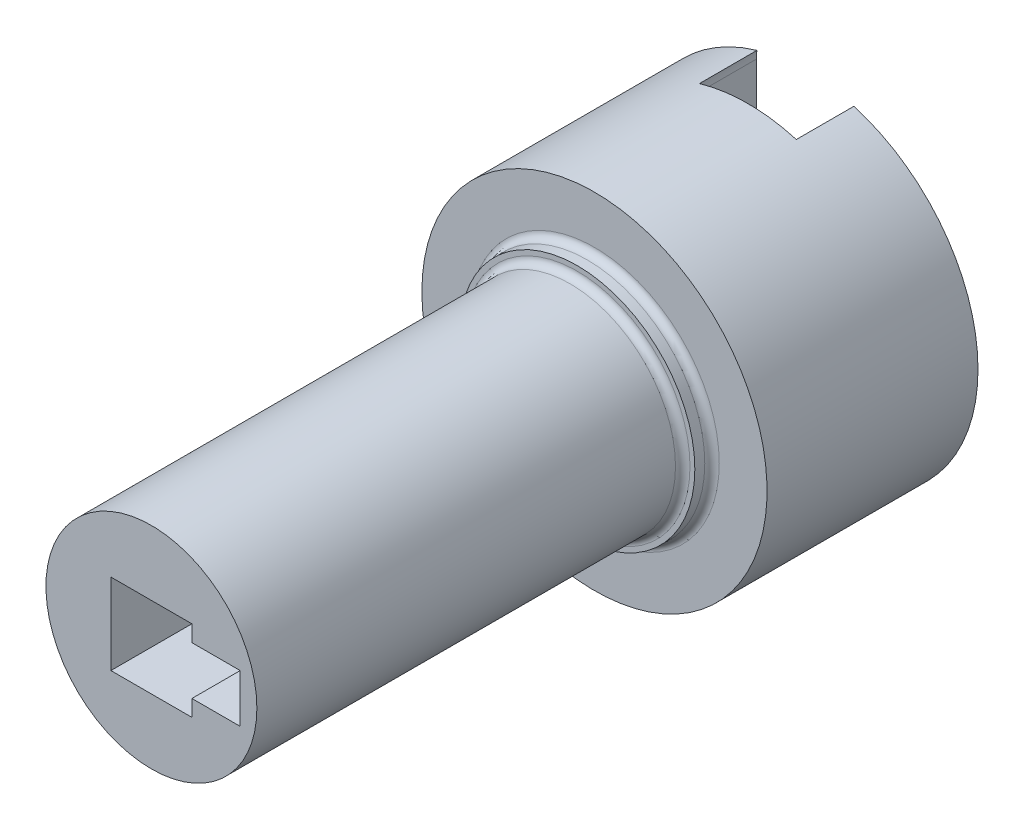
ISO-10303-21;
HEADER;
FILE_DESCRIPTION(('STEP AP214'),'2;1');
FILE_NAME('part.step','',(''),(''),'','','');
FILE_SCHEMA(('AUTOMOTIVE_DESIGN { 1 0 10303 214 1 1 1 1 }'));
ENDSEC;
DATA;
#1=APPLICATION_CONTEXT('core data for automotive mechanical design processes');
#2=APPLICATION_PROTOCOL_DEFINITION('international standard','automotive_design',2000,#1);
#3=PRODUCT_CONTEXT('',#1,'mechanical');
#4=PRODUCT('Part','Part','',(#3));
#5=PRODUCT_RELATED_PRODUCT_CATEGORY('part','',(#4));
#6=PRODUCT_DEFINITION_FORMATION('','',#4);
#7=PRODUCT_DEFINITION_CONTEXT('part definition',#1,'design');
#8=PRODUCT_DEFINITION('design','',#6,#7);
#9=PRODUCT_DEFINITION_SHAPE('','',#8);
#10=(LENGTH_UNIT() NAMED_UNIT(*) SI_UNIT(.MILLI.,.METRE.));
#11=(NAMED_UNIT(*) PLANE_ANGLE_UNIT() SI_UNIT($,.RADIAN.));
#12=(NAMED_UNIT(*) SI_UNIT($,.STERADIAN.) SOLID_ANGLE_UNIT());
#13=UNCERTAINTY_MEASURE_WITH_UNIT(LENGTH_MEASURE(1.E-05),#10,'distance_accuracy_value','');
#14=(GEOMETRIC_REPRESENTATION_CONTEXT(3) GLOBAL_UNCERTAINTY_ASSIGNED_CONTEXT((#13)) GLOBAL_UNIT_ASSIGNED_CONTEXT((#10,
#11,#12)) REPRESENTATION_CONTEXT('',''));
#15=CARTESIAN_POINT('',(0.,0.,0.));
#16=DIRECTION('',(0.,0.,1.));
#17=DIRECTION('',(1.,0.,0.));
#18=AXIS2_PLACEMENT_3D('',#15,#16,#17);
#19=CARTESIAN_POINT('',(-1.7145,3.3782,26.46015));
#20=DIRECTION('',(0.,1.,0.));
#21=DIRECTION('',(0.,0.,1.));
#22=AXIS2_PLACEMENT_3D('',#19,#20,#21);
#23=PLANE('',#22);
#24=DIRECTION('',(0.,0.,-1.));
#25=VECTOR('',#24,1.);
#26=CARTESIAN_POINT('',(-1.7145,3.3782,26.46015));
#27=LINE('',#26,#25);
#28=CARTESIAN_POINT('',(-1.7145,3.3782,25.7489356626244));
#29=VERTEX_POINT('',#28);
#30=CARTESIAN_POINT('',(-1.7145,3.3782,21.11015));
#31=VERTEX_POINT('',#30);
#32=EDGE_CURVE('E355',#29,#31,#27,.T.);
#33=ORIENTED_EDGE('',*,*,#32,.F.);
#34=DIRECTION('',(1.,0.,0.));
#35=VECTOR('',#34,1.);
#36=CARTESIAN_POINT('',(-1.7145,3.3782,25.7489356626244));
#37=LINE('',#36,#35);
#38=CARTESIAN_POINT('',(1.7145,3.3782,25.7489356626244));
#39=VERTEX_POINT('',#38);
#40=EDGE_CURVE('E59',#29,#39,#37,.T.);
#41=ORIENTED_EDGE('',*,*,#40,.T.);
#42=DIRECTION('',(0.,0.,-1.));
#43=VECTOR('',#42,1.);
#44=CARTESIAN_POINT('',(1.7145,3.3782,26.46015));
#45=LINE('',#44,#43);
#46=CARTESIAN_POINT('',(1.7145,3.3782,21.11015));
#47=VERTEX_POINT('',#46);
#48=EDGE_CURVE('E364',#39,#47,#45,.T.);
#49=ORIENTED_EDGE('',*,*,#48,.T.);
#50=DIRECTION('',(-1.,0.,0.));
#51=VECTOR('',#50,1.);
#52=CARTESIAN_POINT('',(1.7145,3.3782,21.11015));
#53=LINE('',#52,#51);
#54=EDGE_CURVE('E351',#47,#31,#53,.T.);
#55=ORIENTED_EDGE('',*,*,#54,.T.);
#56=EDGE_LOOP('',(#33,#41,#49,#55));
#57=FACE_BOUND('',#56,.T.);
#58=ADVANCED_FACE('F43',(#57),#23,.T.);
#59=CARTESIAN_POINT('',(1.7145,3.3782,26.46015));
#60=DIRECTION('',(-1.,0.,0.));
#61=DIRECTION('',(0.,0.,1.));
#62=AXIS2_PLACEMENT_3D('',#59,#60,#61);
#63=PLANE('',#62);
#64=ORIENTED_EDGE('',*,*,#48,.F.);
#65=DIRECTION('',(0.,1.,0.));
#66=VECTOR('',#65,1.);
#67=CARTESIAN_POINT('',(1.7145,3.3782,25.7489356626244));
#68=LINE('',#67,#66);
#69=CARTESIAN_POINT('',(1.7145,6.8072,25.7489356626244));
#70=VERTEX_POINT('',#69);
#71=EDGE_CURVE('E306',#39,#70,#68,.T.);
#72=ORIENTED_EDGE('',*,*,#71,.T.);
#73=DIRECTION('',(0.,0.,-1.));
#74=VECTOR('',#73,1.);
#75=CARTESIAN_POINT('',(1.7145,6.8072,26.46015));
#76=LINE('',#75,#74);
#77=CARTESIAN_POINT('',(1.7145,6.8072,21.11015));
#78=VERTEX_POINT('',#77);
#79=EDGE_CURVE('E361',#70,#78,#76,.T.);
#80=ORIENTED_EDGE('',*,*,#79,.T.);
#81=DIRECTION('',(0.,-1.,0.));
#82=VECTOR('',#81,1.);
#83=CARTESIAN_POINT('',(1.7145,6.8072,21.11015));
#84=LINE('',#83,#82);
#85=EDGE_CURVE('E347',#78,#47,#84,.T.);
#86=ORIENTED_EDGE('',*,*,#85,.T.);
#87=EDGE_LOOP('',(#64,#72,#80,#86));
#88=FACE_BOUND('',#87,.T.);
#89=ADVANCED_FACE('F498',(#88),#63,.T.);
#90=CARTESIAN_POINT('',(1.7145,6.8072,26.46015));
#91=DIRECTION('',(0.,-1.,0.));
#92=DIRECTION('',(0.,0.,-1.));
#93=AXIS2_PLACEMENT_3D('',#90,#91,#92);
#94=PLANE('',#93);
#95=ORIENTED_EDGE('',*,*,#79,.F.);
#96=DIRECTION('',(-1.,0.,0.));
#97=VECTOR('',#96,1.);
#98=CARTESIAN_POINT('',(1.7145,6.8072,25.7489356626244));
#99=LINE('',#98,#97);
#100=CARTESIAN_POINT('',(-1.7145,6.8072,25.7489356626244));
#101=VERTEX_POINT('',#100);
#102=EDGE_CURVE('E287',#70,#101,#99,.T.);
#103=ORIENTED_EDGE('',*,*,#102,.T.);
#104=DIRECTION('',(0.,0.,-1.));
#105=VECTOR('',#104,1.);
#106=CARTESIAN_POINT('',(-1.7145,6.8072,26.46015));
#107=LINE('',#106,#105);
#108=CARTESIAN_POINT('',(-1.7145,6.8072,21.11015));
#109=VERTEX_POINT('',#108);
#110=EDGE_CURVE('E358',#101,#109,#107,.T.);
#111=ORIENTED_EDGE('',*,*,#110,.T.);
#112=DIRECTION('',(1.,0.,0.));
#113=VECTOR('',#112,1.);
#114=CARTESIAN_POINT('',(-1.7145,6.8072,21.11015));
#115=LINE('',#114,#113);
#116=EDGE_CURVE('E343',#109,#78,#115,.T.);
#117=ORIENTED_EDGE('',*,*,#116,.T.);
#118=EDGE_LOOP('',(#95,#103,#111,#117));
#119=FACE_BOUND('',#118,.T.);
#120=ADVANCED_FACE('F505',(#119),#94,.T.);
#121=CARTESIAN_POINT('',(-1.7145,6.8072,26.46015));
#122=DIRECTION('',(1.,0.,0.));
#123=DIRECTION('',(0.,0.,-1.));
#124=AXIS2_PLACEMENT_3D('',#121,#122,#123);
#125=PLANE('',#124);
#126=ORIENTED_EDGE('',*,*,#110,.F.);
#127=DIRECTION('',(0.,-1.,0.));
#128=VECTOR('',#127,1.);
#129=CARTESIAN_POINT('',(-1.7145,6.8072,25.7489356626244));
#130=LINE('',#129,#128);
#131=EDGE_CURVE('E471',#101,#29,#130,.T.);
#132=ORIENTED_EDGE('',*,*,#131,.T.);
#133=ORIENTED_EDGE('',*,*,#32,.T.);
#134=DIRECTION('',(0.,1.,0.));
#135=VECTOR('',#134,1.);
#136=CARTESIAN_POINT('',(-1.7145,3.3782,21.11015));
#137=LINE('',#136,#135);
#138=EDGE_CURVE('E336',#31,#109,#137,.T.);
#139=ORIENTED_EDGE('',*,*,#138,.T.);
#140=EDGE_LOOP('',(#126,#132,#133,#139));
#141=FACE_BOUND('',#140,.T.);
#142=ADVANCED_FACE('F557',(#141),#125,.T.);
#143=CARTESIAN_POINT('',(0.,5.0927,17.7289));
#144=DIRECTION('',(0.,0.,1.));
#145=DIRECTION('',(1.,0.,0.));
#146=AXIS2_PLACEMENT_3D('',#143,#144,#145);
#147=PLANE('',#146);
#148=CARTESIAN_POINT('',(0.,5.0927,17.7289));
#149=DIRECTION('',(0.,0.,1.));
#150=DIRECTION('',(1.,0.,0.));
#151=AXIS2_PLACEMENT_3D('',#148,#149,#150);
#152=CIRCLE('',#151,7.14375);
#153=CARTESIAN_POINT('',(-2.00523079058413,11.9492453064202,17.7289));
#154=VERTEX_POINT('',#153);
#155=CARTESIAN_POINT('',(-2.00523079058413,-1.76384530642024,17.7289));
#156=VERTEX_POINT('',#155);
#157=EDGE_CURVE('E324',#154,#156,#152,.T.);
#158=ORIENTED_EDGE('',*,*,#157,.F.);
#159=CARTESIAN_POINT('',(0.,11.6205,17.7289));
#160=DIRECTION('',(0.,0.,1.));
#161=DIRECTION('',(1.,0.,0.));
#162=AXIS2_PLACEMENT_3D('',#159,#160,#161);
#163=CIRCLE('',#162,2.032);
#164=CARTESIAN_POINT('',(-2.032,11.6205,17.7289));
#165=VERTEX_POINT('',#164);
#166=EDGE_CURVE('E394',#154,#165,#163,.T.);
#167=ORIENTED_EDGE('',*,*,#166,.T.);
#168=DIRECTION('',(0.,-1.,0.));
#169=VECTOR('',#168,1.);
#170=CARTESIAN_POINT('',(-2.032,11.6205,17.7289));
#171=LINE('',#170,#169);
#172=CARTESIAN_POINT('',(-2.032,8.09704768294217,17.7289));
#173=VERTEX_POINT('',#172);
#174=EDGE_CURVE('E399',#165,#173,#171,.T.);
#175=ORIENTED_EDGE('',*,*,#174,.T.);
#176=CARTESIAN_POINT('',(0.,5.0927,17.7289));
#177=DIRECTION('',(0.,0.,1.));
#178=DIRECTION('',(1.,0.,0.));
#179=AXIS2_PLACEMENT_3D('',#176,#177,#178);
#180=CIRCLE('',#179,3.627);
#181=CARTESIAN_POINT('',(-2.032,2.08835231705783,17.7289));
#182=VERTEX_POINT('',#181);
#183=EDGE_CURVE('E368',#173,#182,#180,.T.);
#184=ORIENTED_EDGE('',*,*,#183,.T.);
#185=DIRECTION('',(0.,-1.,0.));
#186=VECTOR('',#185,1.);
#187=CARTESIAN_POINT('',(-2.032,2.08835231705783,17.7289));
#188=LINE('',#187,#186);
#189=CARTESIAN_POINT('',(-2.032,-1.4351,17.7289));
#190=VERTEX_POINT('',#189);
#191=EDGE_CURVE('E372',#182,#190,#188,.T.);
#192=ORIENTED_EDGE('',*,*,#191,.T.);
#193=CARTESIAN_POINT('',(0.,-1.4351,17.7289));
#194=DIRECTION('',(0.,0.,1.));
#195=DIRECTION('',(1.,0.,0.));
#196=AXIS2_PLACEMENT_3D('',#193,#194,#195);
#197=CIRCLE('',#196,2.032);
#198=EDGE_CURVE('E378',#190,#156,#197,.T.);
#199=ORIENTED_EDGE('',*,*,#198,.T.);
#200=EDGE_LOOP('',(#158,#167,#175,#184,#192,#199));
#201=FACE_BOUND('',#200,.T.);
#202=ADVANCED_FACE('F555',(#201),#147,.F.);
#203=CARTESIAN_POINT('',(2.00523079058413,-1.76384530642024,17.7289));
#204=VERTEX_POINT('',#203);
#205=CARTESIAN_POINT('',(2.00523079058413,11.9492453064202,17.7289));
#206=VERTEX_POINT('',#205);
#207=EDGE_CURVE('E321',#204,#206,#152,.T.);
#208=ORIENTED_EDGE('',*,*,#207,.F.);
#209=CARTESIAN_POINT('',(2.032,-1.4351,17.7289));
#210=VERTEX_POINT('',#209);
#211=EDGE_CURVE('E377',#204,#210,#197,.T.);
#212=ORIENTED_EDGE('',*,*,#211,.T.);
#213=DIRECTION('',(0.,1.,0.));
#214=VECTOR('',#213,1.);
#215=CARTESIAN_POINT('',(2.032,-1.4351,17.7289));
#216=LINE('',#215,#214);
#217=CARTESIAN_POINT('',(2.032,2.08835231705782,17.7289));
#218=VERTEX_POINT('',#217);
#219=EDGE_CURVE('E382',#210,#218,#216,.T.);
#220=ORIENTED_EDGE('',*,*,#219,.T.);
#221=CARTESIAN_POINT('',(0.,5.0927,17.7289));
#222=DIRECTION('',(0.,0.,1.));
#223=DIRECTION('',(1.,0.,0.));
#224=AXIS2_PLACEMENT_3D('',#221,#222,#223);
#225=CIRCLE('',#224,3.627);
#226=CARTESIAN_POINT('',(2.032,8.09704768294217,17.7289));
#227=VERTEX_POINT('',#226);
#228=EDGE_CURVE('E386',#218,#227,#225,.T.);
#229=ORIENTED_EDGE('',*,*,#228,.T.);
#230=DIRECTION('',(0.,1.,0.));
#231=VECTOR('',#230,1.);
#232=CARTESIAN_POINT('',(2.032,8.09704768294217,17.7289));
#233=LINE('',#232,#231);
#234=CARTESIAN_POINT('',(2.032,11.6205,17.7289));
#235=VERTEX_POINT('',#234);
#236=EDGE_CURVE('E390',#227,#235,#233,.T.);
#237=ORIENTED_EDGE('',*,*,#236,.T.);
#238=EDGE_CURVE('E395',#235,#206,#163,.T.);
#239=ORIENTED_EDGE('',*,*,#238,.T.);
#240=EDGE_LOOP('',(#208,#212,#220,#229,#237,#239));
#241=FACE_BOUND('',#240,.T.);
#242=ADVANCED_FACE('F530',(#241),#147,.F.);
#243=CARTESIAN_POINT('',(0.,11.6205,17.7289));
#244=DIRECTION('',(0.,0.,1.));
#245=DIRECTION('',(1.,0.,0.));
#246=AXIS2_PLACEMENT_3D('',#243,#244,#245);
#247=CYLINDRICAL_SURFACE('',#246,2.032);
#248=DIRECTION('',(0.,0.,-1.));
#249=VECTOR('',#248,1.);
#250=CARTESIAN_POINT('',(2.00523079058413,11.9492453064202,22.094519));
#251=LINE('',#250,#249);
#252=CARTESIAN_POINT('',(2.00523079058413,11.9492453064202,20.11015));
#253=VERTEX_POINT('',#252);
#254=EDGE_CURVE('E328',#206,#253,#251,.F.);
#255=ORIENTED_EDGE('',*,*,#254,.F.);
#256=ORIENTED_EDGE('',*,*,#238,.F.);
#257=DIRECTION('',(0.,0.,1.));
#258=VECTOR('',#257,1.);
#259=CARTESIAN_POINT('',(2.032,11.6205,17.7289));
#260=LINE('',#259,#258);
#261=CARTESIAN_POINT('',(2.032,11.6205,20.11015));
#262=VERTEX_POINT('',#261);
#263=EDGE_CURVE('E445',#235,#262,#260,.T.);
#264=ORIENTED_EDGE('',*,*,#263,.T.);
#265=CARTESIAN_POINT('',(0.,11.6205,20.11015));
#266=DIRECTION('',(0.,0.,1.));
#267=DIRECTION('',(1.,0.,0.));
#268=AXIS2_PLACEMENT_3D('',#265,#266,#267);
#269=CIRCLE('',#268,2.032);
#270=EDGE_CURVE('E429',#262,#253,#269,.T.);
#271=ORIENTED_EDGE('',*,*,#270,.T.);
#272=EDGE_LOOP('',(#255,#256,#264,#271));
#273=FACE_BOUND('',#272,.T.);
#274=ADVANCED_FACE('F526',(#273),#247,.F.);
#275=DIRECTION('',(0.,0.,-1.));
#276=VECTOR('',#275,1.);
#277=CARTESIAN_POINT('',(-2.00523079058413,11.9492453064202,22.094519));
#278=LINE('',#277,#276);
#279=CARTESIAN_POINT('',(-2.00523079058413,11.9492453064202,20.11015));
#280=VERTEX_POINT('',#279);
#281=EDGE_CURVE('E325',#280,#154,#278,.T.);
#282=ORIENTED_EDGE('',*,*,#281,.F.);
#283=CARTESIAN_POINT('',(-2.032,11.6205,20.11015));
#284=VERTEX_POINT('',#283);
#285=EDGE_CURVE('E428',#280,#284,#269,.T.);
#286=ORIENTED_EDGE('',*,*,#285,.T.);
#287=DIRECTION('',(0.,0.,1.));
#288=VECTOR('',#287,1.);
#289=CARTESIAN_POINT('',(-2.032,11.6205,17.7289));
#290=LINE('',#289,#288);
#291=EDGE_CURVE('E441',#165,#284,#290,.T.);
#292=ORIENTED_EDGE('',*,*,#291,.F.);
#293=ORIENTED_EDGE('',*,*,#166,.F.);
#294=EDGE_LOOP('',(#282,#286,#292,#293));
#295=FACE_BOUND('',#294,.T.);
#296=ADVANCED_FACE('F529',(#295),#247,.F.);
#297=CARTESIAN_POINT('',(0.,-1.4351,17.7289));
#298=DIRECTION('',(0.,0.,1.));
#299=DIRECTION('',(1.,0.,0.));
#300=AXIS2_PLACEMENT_3D('',#297,#298,#299);
#301=CYLINDRICAL_SURFACE('',#300,2.032);
#302=DIRECTION('',(0.,0.,-1.));
#303=VECTOR('',#302,1.);
#304=CARTESIAN_POINT('',(-2.00523079058413,-1.76384530642024,22.094519));
#305=LINE('',#304,#303);
#306=CARTESIAN_POINT('',(-2.00523079058413,-1.76384530642024,20.11015));
#307=VERTEX_POINT('',#306);
#308=EDGE_CURVE('E67',#156,#307,#305,.F.);
#309=ORIENTED_EDGE('',*,*,#308,.F.);
#310=ORIENTED_EDGE('',*,*,#198,.F.);
#311=DIRECTION('',(0.,0.,1.));
#312=VECTOR('',#311,1.);
#313=CARTESIAN_POINT('',(-2.032,-1.4351,17.7289));
#314=LINE('',#313,#312);
#315=CARTESIAN_POINT('',(-2.032,-1.4351,20.11015));
#316=VERTEX_POINT('',#315);
#317=EDGE_CURVE('E461',#190,#316,#314,.T.);
#318=ORIENTED_EDGE('',*,*,#317,.T.);
#319=CARTESIAN_POINT('',(0.,-1.4351,20.11015));
#320=DIRECTION('',(0.,0.,1.));
#321=DIRECTION('',(1.,0.,0.));
#322=AXIS2_PLACEMENT_3D('',#319,#320,#321);
#323=CIRCLE('',#322,2.032);
#324=EDGE_CURVE('E412',#316,#307,#323,.T.);
#325=ORIENTED_EDGE('',*,*,#324,.T.);
#326=EDGE_LOOP('',(#309,#310,#318,#325));
#327=FACE_BOUND('',#326,.T.);
#328=ADVANCED_FACE('F544',(#327),#301,.F.);
#329=DIRECTION('',(0.,0.,-1.));
#330=VECTOR('',#329,1.);
#331=CARTESIAN_POINT('',(2.00523079058413,-1.76384530642024,22.094519));
#332=LINE('',#331,#330);
#333=CARTESIAN_POINT('',(2.00523079058413,-1.76384530642024,20.11015));
#334=VERTEX_POINT('',#333);
#335=EDGE_CURVE('E316',#334,#204,#332,.T.);
#336=ORIENTED_EDGE('',*,*,#335,.F.);
#337=CARTESIAN_POINT('',(2.032,-1.4351,20.11015));
#338=VERTEX_POINT('',#337);
#339=EDGE_CURVE('E411',#334,#338,#323,.T.);
#340=ORIENTED_EDGE('',*,*,#339,.T.);
#341=DIRECTION('',(0.,0.,1.));
#342=VECTOR('',#341,1.);
#343=CARTESIAN_POINT('',(2.032,-1.4351,17.7289));
#344=LINE('',#343,#342);
#345=EDGE_CURVE('E457',#210,#338,#344,.T.);
#346=ORIENTED_EDGE('',*,*,#345,.F.);
#347=ORIENTED_EDGE('',*,*,#211,.F.);
#348=EDGE_LOOP('',(#336,#340,#346,#347));
#349=FACE_BOUND('',#348,.T.);
#350=ADVANCED_FACE('F515',(#349),#301,.F.);
#351=CARTESIAN_POINT('',(0.,5.0927,26.46015));
#352=DIRECTION('',(0.,0.,1.));
#353=DIRECTION('',(1.,0.,0.));
#354=AXIS2_PLACEMENT_3D('',#351,#352,#353);
#355=PLANE('',#354);
#356=CARTESIAN_POINT('',(0.,5.0927,26.46015));
#357=DIRECTION('',(0.,0.,1.));
#358=DIRECTION('',(1.,0.,0.));
#359=AXIS2_PLACEMENT_3D('',#356,#357,#358);
#360=CIRCLE('',#359,5.165625);
#361=CARTESIAN_POINT('',(5.165625,5.0927,26.46015));
#362=VERTEX_POINT('',#361);
#363=EDGE_CURVE('E11',#362,#362,#360,.F.);
#364=ORIENTED_EDGE('',*,*,#363,.T.);
#365=EDGE_LOOP('',(#364));
#366=FACE_BOUND('',#365,.T.);
#367=CARTESIAN_POINT('',(0.,5.0927,26.46015));
#368=DIRECTION('',(0.,0.,-1.));
#369=DIRECTION('',(-1.,0.,0.));
#370=AXIS2_PLACEMENT_3D('',#367,#368,#369);
#371=CIRCLE('',#370,7.14375);
#372=CARTESIAN_POINT('',(-7.14375,5.0927,26.46015));
#373=VERTEX_POINT('',#372);
#374=EDGE_CURVE('E312',#373,#373,#371,.T.);
#375=ORIENTED_EDGE('',*,*,#374,.F.);
#376=EDGE_LOOP('',(#375));
#377=FACE_BOUND('',#376,.T.);
#378=ADVANCED_FACE('F511',(#366,#377),#355,.T.);
#379=CARTESIAN_POINT('',(0.,5.0927,20.11015));
#380=DIRECTION('',(0.,0.,1.));
#381=DIRECTION('',(1.,0.,0.));
#382=AXIS2_PLACEMENT_3D('',#379,#380,#381);
#383=PLANE('',#382);
#384=CARTESIAN_POINT('',(0.,5.0927,20.11015));
#385=DIRECTION('',(0.,0.,-1.));
#386=DIRECTION('',(-1.,0.,0.));
#387=AXIS2_PLACEMENT_3D('',#384,#385,#386);
#388=CIRCLE('',#387,1.25);
#389=CARTESIAN_POINT('',(-1.25,5.0927,20.11015));
#390=VERTEX_POINT('',#389);
#391=EDGE_CURVE('E331',#390,#390,#388,.T.);
#392=ORIENTED_EDGE('',*,*,#391,.F.);
#393=EDGE_LOOP('',(#392));
#394=FACE_BOUND('',#393,.T.);
#395=CARTESIAN_POINT('',(0.,5.0927,20.11015));
#396=DIRECTION('',(0.,0.,1.));
#397=DIRECTION('',(1.,0.,0.));
#398=AXIS2_PLACEMENT_3D('',#395,#396,#397);
#399=CIRCLE('',#398,7.14375);
#400=EDGE_CURVE('E470',#253,#280,#399,.T.);
#401=ORIENTED_EDGE('',*,*,#400,.F.);
#402=ORIENTED_EDGE('',*,*,#270,.F.);
#403=DIRECTION('',(0.,1.,0.));
#404=VECTOR('',#403,1.);
#405=CARTESIAN_POINT('',(2.032,8.09704768294217,20.11015));
#406=LINE('',#405,#404);
#407=CARTESIAN_POINT('',(2.032,8.09704768294217,20.11015));
#408=VERTEX_POINT('',#407);
#409=EDGE_CURVE('E424',#408,#262,#406,.T.);
#410=ORIENTED_EDGE('',*,*,#409,.F.);
#411=CARTESIAN_POINT('',(0.,5.0927,20.11015));
#412=DIRECTION('',(0.,0.,1.));
#413=DIRECTION('',(1.,0.,0.));
#414=AXIS2_PLACEMENT_3D('',#411,#412,#413);
#415=CIRCLE('',#414,3.627);
#416=CARTESIAN_POINT('',(2.032,2.08835231705782,20.11015));
#417=VERTEX_POINT('',#416);
#418=EDGE_CURVE('E420',#417,#408,#415,.T.);
#419=ORIENTED_EDGE('',*,*,#418,.F.);
#420=DIRECTION('',(0.,1.,0.));
#421=VECTOR('',#420,1.);
#422=CARTESIAN_POINT('',(2.032,-1.4351,20.11015));
#423=LINE('',#422,#421);
#424=EDGE_CURVE('E416',#338,#417,#423,.T.);
#425=ORIENTED_EDGE('',*,*,#424,.F.);
#426=ORIENTED_EDGE('',*,*,#339,.F.);
#427=EDGE_CURVE('E440',#307,#334,#399,.T.);
#428=ORIENTED_EDGE('',*,*,#427,.F.);
#429=ORIENTED_EDGE('',*,*,#324,.F.);
#430=DIRECTION('',(0.,-1.,0.));
#431=VECTOR('',#430,1.);
#432=CARTESIAN_POINT('',(-2.032,2.08835231705783,20.11015));
#433=LINE('',#432,#431);
#434=CARTESIAN_POINT('',(-2.032,2.08835231705783,20.11015));
#435=VERTEX_POINT('',#434);
#436=EDGE_CURVE('E407',#435,#316,#433,.T.);
#437=ORIENTED_EDGE('',*,*,#436,.F.);
#438=CARTESIAN_POINT('',(0.,5.0927,20.11015));
#439=DIRECTION('',(0.,0.,1.));
#440=DIRECTION('',(1.,0.,0.));
#441=AXIS2_PLACEMENT_3D('',#438,#439,#440);
#442=CIRCLE('',#441,3.627);
#443=CARTESIAN_POINT('',(-2.032,8.09704768294217,20.11015));
#444=VERTEX_POINT('',#443);
#445=EDGE_CURVE('E367',#444,#435,#442,.T.);
#446=ORIENTED_EDGE('',*,*,#445,.F.);
#447=DIRECTION('',(0.,-1.,0.));
#448=VECTOR('',#447,1.);
#449=CARTESIAN_POINT('',(-2.032,11.6205,20.11015));
#450=LINE('',#449,#448);
#451=EDGE_CURVE('E373',#284,#444,#450,.T.);
#452=ORIENTED_EDGE('',*,*,#451,.F.);
#453=ORIENTED_EDGE('',*,*,#285,.F.);
#454=EDGE_LOOP('',(#401,#402,#410,#419,#425,#426,#428,#429,#437,#446,#452,#453));
#455=FACE_BOUND('',#454,.T.);
#456=ADVANCED_FACE('F514',(#394,#455),#383,.F.);
#457=CARTESIAN_POINT('',(0.,5.0927,17.7289));
#458=DIRECTION('',(0.,0.,1.));
#459=DIRECTION('',(1.,0.,0.));
#460=AXIS2_PLACEMENT_3D('',#457,#458,#459);
#461=CYLINDRICAL_SURFACE('',#460,3.627);
#462=ORIENTED_EDGE('',*,*,#445,.T.);
#463=DIRECTION('',(0.,0.,1.));
#464=VECTOR('',#463,1.);
#465=CARTESIAN_POINT('',(-2.032,2.08835231705783,17.7289));
#466=LINE('',#465,#464);
#467=EDGE_CURVE('E403',#182,#435,#466,.T.);
#468=ORIENTED_EDGE('',*,*,#467,.F.);
#469=ORIENTED_EDGE('',*,*,#183,.F.);
#470=DIRECTION('',(0.,0.,1.));
#471=VECTOR('',#470,1.);
#472=CARTESIAN_POINT('',(-2.032,8.09704768294217,17.7289));
#473=LINE('',#472,#471);
#474=EDGE_CURVE('E436',#173,#444,#473,.T.);
#475=ORIENTED_EDGE('',*,*,#474,.T.);
#476=EDGE_LOOP('',(#462,#468,#469,#475));
#477=FACE_BOUND('',#476,.T.);
#478=ADVANCED_FACE('F519',(#477),#461,.F.);
#479=CARTESIAN_POINT('',(-2.032,11.6205,17.7289));
#480=DIRECTION('',(-1.,0.,0.));
#481=DIRECTION('',(0.,0.,1.));
#482=AXIS2_PLACEMENT_3D('',#479,#480,#481);
#483=PLANE('',#482);
#484=ORIENTED_EDGE('',*,*,#451,.T.);
#485=ORIENTED_EDGE('',*,*,#474,.F.);
#486=ORIENTED_EDGE('',*,*,#174,.F.);
#487=ORIENTED_EDGE('',*,*,#291,.T.);
#488=EDGE_LOOP('',(#484,#485,#486,#487));
#489=FACE_BOUND('',#488,.T.);
#490=ADVANCED_FACE('F521',(#489),#483,.F.);
#491=CARTESIAN_POINT('',(2.032,8.09704768294217,17.7289));
#492=DIRECTION('',(1.,0.,0.));
#493=DIRECTION('',(0.,1.,0.));
#494=AXIS2_PLACEMENT_3D('',#491,#492,#493);
#495=PLANE('',#494);
#496=ORIENTED_EDGE('',*,*,#409,.T.);
#497=ORIENTED_EDGE('',*,*,#263,.F.);
#498=ORIENTED_EDGE('',*,*,#236,.F.);
#499=DIRECTION('',(0.,0.,1.));
#500=VECTOR('',#499,1.);
#501=CARTESIAN_POINT('',(2.032,8.09704768294217,17.7289));
#502=LINE('',#501,#500);
#503=EDGE_CURVE('E449',#227,#408,#502,.T.);
#504=ORIENTED_EDGE('',*,*,#503,.T.);
#505=EDGE_LOOP('',(#496,#497,#498,#504));
#506=FACE_BOUND('',#505,.T.);
#507=ADVANCED_FACE('F524',(#506),#495,.F.);
#508=CARTESIAN_POINT('',(0.,5.0927,17.7289));
#509=DIRECTION('',(0.,0.,1.));
#510=DIRECTION('',(1.,0.,0.));
#511=AXIS2_PLACEMENT_3D('',#508,#509,#510);
#512=CYLINDRICAL_SURFACE('',#511,3.627);
#513=ORIENTED_EDGE('',*,*,#418,.T.);
#514=ORIENTED_EDGE('',*,*,#503,.F.);
#515=ORIENTED_EDGE('',*,*,#228,.F.);
#516=DIRECTION('',(0.,0.,1.));
#517=VECTOR('',#516,1.);
#518=CARTESIAN_POINT('',(2.032,2.08835231705782,17.7289));
#519=LINE('',#518,#517);
#520=EDGE_CURVE('E453',#218,#417,#519,.T.);
#521=ORIENTED_EDGE('',*,*,#520,.T.);
#522=EDGE_LOOP('',(#513,#514,#515,#521));
#523=FACE_BOUND('',#522,.T.);
#524=ADVANCED_FACE('F534',(#523),#512,.F.);
#525=CARTESIAN_POINT('',(2.032,-1.4351,17.7289));
#526=DIRECTION('',(1.,0.,0.));
#527=DIRECTION('',(0.,1.,0.));
#528=AXIS2_PLACEMENT_3D('',#525,#526,#527);
#529=PLANE('',#528);
#530=ORIENTED_EDGE('',*,*,#424,.T.);
#531=ORIENTED_EDGE('',*,*,#520,.F.);
#532=ORIENTED_EDGE('',*,*,#219,.F.);
#533=ORIENTED_EDGE('',*,*,#345,.T.);
#534=EDGE_LOOP('',(#530,#531,#532,#533));
#535=FACE_BOUND('',#534,.T.);
#536=ADVANCED_FACE('F538',(#535),#529,.F.);
#537=CARTESIAN_POINT('',(-2.032,2.08835231705783,17.7289));
#538=DIRECTION('',(-1.,0.,0.));
#539=DIRECTION('',(0.,-1.,0.));
#540=AXIS2_PLACEMENT_3D('',#537,#538,#539);
#541=PLANE('',#540);
#542=ORIENTED_EDGE('',*,*,#436,.T.);
#543=ORIENTED_EDGE('',*,*,#317,.F.);
#544=ORIENTED_EDGE('',*,*,#191,.F.);
#545=ORIENTED_EDGE('',*,*,#467,.T.);
#546=EDGE_LOOP('',(#542,#543,#544,#545));
#547=FACE_BOUND('',#546,.T.);
#548=ADVANCED_FACE('F542',(#547),#541,.F.);
#549=CARTESIAN_POINT('',(0.,0.,21.11015));
#550=DIRECTION('',(0.,0.,-1.));
#551=DIRECTION('',(-1.,0.,0.));
#552=AXIS2_PLACEMENT_3D('',#549,#550,#551);
#553=PLANE('',#552);
#554=CARTESIAN_POINT('',(0.,5.0927,21.11015));
#555=DIRECTION('',(0.,0.,-1.));
#556=DIRECTION('',(-1.,0.,0.));
#557=AXIS2_PLACEMENT_3D('',#554,#555,#556);
#558=CIRCLE('',#557,1.25);
#559=CARTESIAN_POINT('',(-1.25,5.0927,21.11015));
#560=VERTEX_POINT('',#559);
#561=EDGE_CURVE('E332',#560,#560,#558,.T.);
#562=ORIENTED_EDGE('',*,*,#561,.T.);
#563=EDGE_LOOP('',(#562));
#564=FACE_BOUND('',#563,.T.);
#565=ORIENTED_EDGE('',*,*,#138,.F.);
#566=ORIENTED_EDGE('',*,*,#54,.F.);
#567=ORIENTED_EDGE('',*,*,#85,.F.);
#568=ORIENTED_EDGE('',*,*,#116,.F.);
#569=EDGE_LOOP('',(#565,#566,#567,#568));
#570=FACE_BOUND('',#569,.T.);
#571=ADVANCED_FACE('F550',(#564,#570),#553,.F.);
#572=CARTESIAN_POINT('',(0.,5.0927,21.11015));
#573=DIRECTION('',(0.,0.,-1.));
#574=DIRECTION('',(-1.,0.,0.));
#575=AXIS2_PLACEMENT_3D('',#572,#573,#574);
#576=CYLINDRICAL_SURFACE('',#575,1.25);
#577=ORIENTED_EDGE('',*,*,#561,.F.);
#578=EDGE_LOOP('',(#577));
#579=FACE_BOUND('',#578,.T.);
#580=ORIENTED_EDGE('',*,*,#391,.T.);
#581=EDGE_LOOP('',(#580));
#582=FACE_BOUND('',#581,.T.);
#583=ADVANCED_FACE('F636',(#579,#582),#576,.F.);
#584=CARTESIAN_POINT('',(0.,5.0927,26.46015));
#585=DIRECTION('',(0.,0.,-1.));
#586=DIRECTION('',(-1.,0.,0.));
#587=AXIS2_PLACEMENT_3D('',#584,#585,#586);
#588=CYLINDRICAL_SURFACE('',#587,7.14375);
#589=ORIENTED_EDGE('',*,*,#374,.T.);
#590=EDGE_LOOP('',(#589));
#591=FACE_BOUND('',#590,.T.);
#592=ORIENTED_EDGE('',*,*,#400,.T.);
#593=ORIENTED_EDGE('',*,*,#281,.T.);
#594=ORIENTED_EDGE('',*,*,#157,.T.);
#595=ORIENTED_EDGE('',*,*,#308,.T.);
#596=ORIENTED_EDGE('',*,*,#427,.T.);
#597=ORIENTED_EDGE('',*,*,#335,.T.);
#598=ORIENTED_EDGE('',*,*,#207,.T.);
#599=ORIENTED_EDGE('',*,*,#254,.T.);
#600=EDGE_LOOP('',(#592,#593,#594,#595,#596,#597,#598,#599));
#601=FACE_BOUND('',#600,.T.);
#602=ADVANCED_FACE('F632',(#591,#601),#588,.T.);
#603=CARTESIAN_POINT('',(0.,5.0927,57.3467878290945));
#604=DIRECTION('',(0.,0.,-1.));
#605=DIRECTION('',(0.,1.,0.));
#606=AXIS2_PLACEMENT_3D('',#603,#604,#605);
#607=CYLINDRICAL_SURFACE('',#606,4.365625);
#608=CARTESIAN_POINT('',(0.,5.0927,27.4713643373756));
#609=DIRECTION('',(0.,0.,1.));
#610=DIRECTION('',(1.,0.,0.));
#611=AXIS2_PLACEMENT_3D('',#608,#609,#610);
#612=CIRCLE('',#611,4.365625);
#613=CARTESIAN_POINT('',(4.365625,5.0927,27.4713643373756));
#614=VERTEX_POINT('',#613);
#615=EDGE_CURVE('E478',#614,#614,#612,.T.);
#616=ORIENTED_EDGE('',*,*,#615,.T.);
#617=EDGE_LOOP('',(#616));
#618=FACE_BOUND('',#617,.T.);
#619=CARTESIAN_POINT('',(0.,5.0927,44.7989356626244));
#620=DIRECTION('',(0.,0.,1.));
#621=DIRECTION('',(0.,-1.,0.));
#622=AXIS2_PLACEMENT_3D('',#619,#620,#621);
#623=CIRCLE('',#622,4.365625);
#624=CARTESIAN_POINT('',(0.,0.727074999999999,44.7989356626244));
#625=VERTEX_POINT('',#624);
#626=EDGE_CURVE('E283',#625,#625,#623,.T.);
#627=ORIENTED_EDGE('',*,*,#626,.F.);
#628=EDGE_LOOP('',(#627));
#629=FACE_BOUND('',#628,.T.);
#630=ADVANCED_FACE('F623',(#618,#629),#607,.T.);
#631=CARTESIAN_POINT('',(-1.6764,6.7691,57.3467878290945));
#632=DIRECTION('',(0.,-1.,0.));
#633=DIRECTION('',(1.,0.,0.));
#634=AXIS2_PLACEMENT_3D('',#631,#632,#633);
#635=PLANE('',#634);
#636=DIRECTION('',(0.,0.,-1.));
#637=VECTOR('',#636,1.);
#638=CARTESIAN_POINT('',(1.6764,6.7691,57.3467878290945));
#639=LINE('',#638,#637);
#640=CARTESIAN_POINT('',(1.6764,6.7691,44.7989356626244));
#641=VERTEX_POINT('',#640);
#642=CARTESIAN_POINT('',(1.6764,6.7691,25.7489356626244));
#643=VERTEX_POINT('',#642);
#644=EDGE_CURVE('E291',#641,#643,#639,.T.);
#645=ORIENTED_EDGE('',*,*,#644,.F.);
#646=DIRECTION('',(-1.,0.,0.));
#647=VECTOR('',#646,1.);
#648=CARTESIAN_POINT('',(-1.6764,6.7691,44.7989356626244));
#649=LINE('',#648,#647);
#650=CARTESIAN_POINT('',(-1.6764,6.7691,44.7989356626244));
#651=VERTEX_POINT('',#650);
#652=EDGE_CURVE('E288',#641,#651,#649,.T.);
#653=ORIENTED_EDGE('',*,*,#652,.T.);
#654=DIRECTION('',(0.,0.,-1.));
#655=VECTOR('',#654,1.);
#656=CARTESIAN_POINT('',(-1.6764,6.7691,57.3467878290945));
#657=LINE('',#656,#655);
#658=CARTESIAN_POINT('',(-1.6764,6.7691,25.7489356626244));
#659=VERTEX_POINT('',#658);
#660=EDGE_CURVE('E282',#651,#659,#657,.T.);
#661=ORIENTED_EDGE('',*,*,#660,.T.);
#662=DIRECTION('',(1.,0.,0.));
#663=VECTOR('',#662,1.);
#664=CARTESIAN_POINT('',(-1.6764,6.7691,25.7489356626244));
#665=LINE('',#664,#663);
#666=EDGE_CURVE('E260',#659,#643,#665,.T.);
#667=ORIENTED_EDGE('',*,*,#666,.T.);
#668=EDGE_LOOP('',(#645,#653,#661,#667));
#669=FACE_BOUND('',#668,.T.);
#670=ADVANCED_FACE('F606',(#669),#635,.T.);
#671=CARTESIAN_POINT('',(1.6764,3.4163,57.3467878290945));
#672=DIRECTION('',(-1.,0.,0.));
#673=DIRECTION('',(0.,-1.,0.));
#674=AXIS2_PLACEMENT_3D('',#671,#672,#673);
#675=PLANE('',#674);
#676=DIRECTION('',(0.,0.,1.));
#677=VECTOR('',#676,1.);
#678=CARTESIAN_POINT('',(1.6764,6.0927,39.2705085378782));
#679=LINE('',#678,#677);
#680=CARTESIAN_POINT('',(1.6764,6.0927,42.0989356626244));
#681=VERTEX_POINT('',#680);
#682=CARTESIAN_POINT('',(1.6764,6.0927,44.7989356626244));
#683=VERTEX_POINT('',#682);
#684=EDGE_CURVE('E238',#681,#683,#679,.T.);
#685=ORIENTED_EDGE('',*,*,#684,.T.);
#686=DIRECTION('',(0.,1.,0.));
#687=VECTOR('',#686,1.);
#688=CARTESIAN_POINT('',(1.6764,3.4163,44.7989356626244));
#689=LINE('',#688,#687);
#690=EDGE_CURVE('E259',#683,#641,#689,.T.);
#691=ORIENTED_EDGE('',*,*,#690,.T.);
#692=ORIENTED_EDGE('',*,*,#644,.T.);
#693=DIRECTION('',(0.,-1.,0.));
#694=VECTOR('',#693,1.);
#695=CARTESIAN_POINT('',(1.6764,3.4163,25.7489356626244));
#696=LINE('',#695,#694);
#697=CARTESIAN_POINT('',(1.6764,3.4163,25.7489356626244));
#698=VERTEX_POINT('',#697);
#699=EDGE_CURVE('E255',#643,#698,#696,.T.);
#700=ORIENTED_EDGE('',*,*,#699,.T.);
#701=DIRECTION('',(0.,0.,-1.));
#702=VECTOR('',#701,1.);
#703=CARTESIAN_POINT('',(1.6764,3.4163,57.3467878290945));
#704=LINE('',#703,#702);
#705=CARTESIAN_POINT('',(1.6764,3.4163,44.7989356626244));
#706=VERTEX_POINT('',#705);
#707=EDGE_CURVE('E294',#706,#698,#704,.T.);
#708=ORIENTED_EDGE('',*,*,#707,.F.);
#709=CARTESIAN_POINT('',(1.6764,4.0927,44.7989356626244));
#710=VERTEX_POINT('',#709);
#711=EDGE_CURVE('E271',#706,#710,#689,.T.);
#712=ORIENTED_EDGE('',*,*,#711,.T.);
#713=DIRECTION('',(0.,0.,1.));
#714=VECTOR('',#713,1.);
#715=CARTESIAN_POINT('',(1.6764,4.0927,39.2705085378782));
#716=LINE('',#715,#714);
#717=CARTESIAN_POINT('',(1.6764,4.0927,42.0989356626244));
#718=VERTEX_POINT('',#717);
#719=EDGE_CURVE('E218',#718,#710,#716,.T.);
#720=ORIENTED_EDGE('',*,*,#719,.F.);
#721=DIRECTION('',(0.,1.,0.));
#722=VECTOR('',#721,1.);
#723=CARTESIAN_POINT('',(1.6764,6.0927,42.0989356626244));
#724=LINE('',#723,#722);
#725=EDGE_CURVE('E250',#718,#681,#724,.T.);
#726=ORIENTED_EDGE('',*,*,#725,.T.);
#727=EDGE_LOOP('',(#685,#691,#692,#700,#708,#712,#720,#726));
#728=FACE_BOUND('',#727,.T.);
#729=ADVANCED_FACE('F592',(#728),#675,.T.);
#730=CARTESIAN_POINT('',(-1.6764,3.4163,57.3467878290945));
#731=DIRECTION('',(0.,1.,0.));
#732=DIRECTION('',(-1.,0.,0.));
#733=AXIS2_PLACEMENT_3D('',#730,#731,#732);
#734=PLANE('',#733);
#735=DIRECTION('',(0.,0.,-1.));
#736=VECTOR('',#735,1.);
#737=CARTESIAN_POINT('',(-1.6764,3.4163,57.3467878290945));
#738=LINE('',#737,#736);
#739=CARTESIAN_POINT('',(-1.6764,3.4163,44.7989356626244));
#740=VERTEX_POINT('',#739);
#741=CARTESIAN_POINT('',(-1.6764,3.4163,25.7489356626244));
#742=VERTEX_POINT('',#741);
#743=EDGE_CURVE('E297',#740,#742,#738,.T.);
#744=ORIENTED_EDGE('',*,*,#743,.F.);
#745=DIRECTION('',(1.,0.,0.));
#746=VECTOR('',#745,1.);
#747=CARTESIAN_POINT('',(-1.6764,3.4163,44.7989356626244));
#748=LINE('',#747,#746);
#749=EDGE_CURVE('E274',#740,#706,#748,.T.);
#750=ORIENTED_EDGE('',*,*,#749,.T.);
#751=ORIENTED_EDGE('',*,*,#707,.T.);
#752=DIRECTION('',(-1.,0.,0.));
#753=VECTOR('',#752,1.);
#754=CARTESIAN_POINT('',(-1.6764,3.4163,25.7489356626244));
#755=LINE('',#754,#753);
#756=EDGE_CURVE('E254',#698,#742,#755,.T.);
#757=ORIENTED_EDGE('',*,*,#756,.T.);
#758=EDGE_LOOP('',(#744,#750,#751,#757));
#759=FACE_BOUND('',#758,.T.);
#760=ADVANCED_FACE('F598',(#759),#734,.T.);
#761=CARTESIAN_POINT('',(-1.6764,3.4163,57.3467878290945));
#762=DIRECTION('',(1.,0.,0.));
#763=DIRECTION('',(0.,1.,0.));
#764=AXIS2_PLACEMENT_3D('',#761,#762,#763);
#765=PLANE('',#764);
#766=ORIENTED_EDGE('',*,*,#660,.F.);
#767=DIRECTION('',(0.,-1.,0.));
#768=VECTOR('',#767,1.);
#769=CARTESIAN_POINT('',(-1.6764,3.4163,44.7989356626244));
#770=LINE('',#769,#768);
#771=EDGE_CURVE('E278',#651,#740,#770,.T.);
#772=ORIENTED_EDGE('',*,*,#771,.T.);
#773=ORIENTED_EDGE('',*,*,#743,.T.);
#774=DIRECTION('',(0.,1.,0.));
#775=VECTOR('',#774,1.);
#776=CARTESIAN_POINT('',(-1.6764,3.4163,25.7489356626244));
#777=LINE('',#776,#775);
#778=EDGE_CURVE('E264',#742,#659,#777,.T.);
#779=ORIENTED_EDGE('',*,*,#778,.T.);
#780=EDGE_LOOP('',(#766,#772,#773,#779));
#781=FACE_BOUND('',#780,.T.);
#782=ADVANCED_FACE('F602',(#781),#765,.T.);
#783=CARTESIAN_POINT('',(4.11861637198881,18.7363163719889,44.7989356626244));
#784=DIRECTION('',(0.,0.,1.));
#785=DIRECTION('',(0.,-1.,0.));
#786=AXIS2_PLACEMENT_3D('',#783,#784,#785);
#787=PLANE('',#786);
#788=DIRECTION('',(-1.,0.,0.));
#789=VECTOR('',#788,1.);
#790=CARTESIAN_POINT('',(1.6764,6.0927,44.7989356626244));
#791=LINE('',#790,#789);
#792=CARTESIAN_POINT('',(3.6764,6.0927,44.7989356626244));
#793=VERTEX_POINT('',#792);
#794=EDGE_CURVE('E231',#793,#683,#791,.T.);
#795=ORIENTED_EDGE('',*,*,#794,.F.);
#796=DIRECTION('',(0.,1.,0.));
#797=VECTOR('',#796,1.);
#798=CARTESIAN_POINT('',(3.6764,6.0927,44.7989356626244));
#799=LINE('',#798,#797);
#800=CARTESIAN_POINT('',(3.6764,4.0927,44.7989356626244));
#801=VERTEX_POINT('',#800);
#802=EDGE_CURVE('E210',#801,#793,#799,.T.);
#803=ORIENTED_EDGE('',*,*,#802,.F.);
#804=DIRECTION('',(1.,0.,0.));
#805=VECTOR('',#804,1.);
#806=CARTESIAN_POINT('',(1.6764,4.0927,44.7989356626244));
#807=LINE('',#806,#805);
#808=EDGE_CURVE('E221',#710,#801,#807,.T.);
#809=ORIENTED_EDGE('',*,*,#808,.F.);
#810=ORIENTED_EDGE('',*,*,#711,.F.);
#811=ORIENTED_EDGE('',*,*,#749,.F.);
#812=ORIENTED_EDGE('',*,*,#771,.F.);
#813=ORIENTED_EDGE('',*,*,#652,.F.);
#814=ORIENTED_EDGE('',*,*,#690,.F.);
#815=EDGE_LOOP('',(#795,#803,#809,#810,#811,#812,#813,#814));
#816=FACE_BOUND('',#815,.T.);
#817=ORIENTED_EDGE('',*,*,#626,.T.);
#818=EDGE_LOOP('',(#817));
#819=FACE_BOUND('',#818,.T.);
#820=ADVANCED_FACE('F228',(#816,#819),#787,.T.);
#821=CARTESIAN_POINT('',(4.11861637198881,18.7363163719889,25.7489356626244));
#822=DIRECTION('',(0.,0.,1.));
#823=DIRECTION('',(0.,-1.,0.));
#824=AXIS2_PLACEMENT_3D('',#821,#822,#823);
#825=PLANE('',#824);
#826=ORIENTED_EDGE('',*,*,#40,.F.);
#827=ORIENTED_EDGE('',*,*,#131,.F.);
#828=ORIENTED_EDGE('',*,*,#102,.F.);
#829=ORIENTED_EDGE('',*,*,#71,.F.);
#830=EDGE_LOOP('',(#826,#827,#828,#829));
#831=FACE_BOUND('',#830,.T.);
#832=ORIENTED_EDGE('',*,*,#756,.F.);
#833=ORIENTED_EDGE('',*,*,#699,.F.);
#834=ORIENTED_EDGE('',*,*,#666,.F.);
#835=ORIENTED_EDGE('',*,*,#778,.F.);
#836=EDGE_LOOP('',(#832,#833,#834,#835));
#837=FACE_BOUND('',#836,.T.);
#838=ADVANCED_FACE('F609',(#831,#837),#825,.F.);
#839=CARTESIAN_POINT('',(0.,5.0927,41.1334300662187));
#840=DIRECTION('',(0.,0.,-1.));
#841=DIRECTION('',(0.,1.,0.));
#842=AXIS2_PLACEMENT_3D('',#839,#840,#841);
#843=CYLINDRICAL_SURFACE('',#842,4.865625);
#844=CARTESIAN_POINT('',(0.,5.0927,26.76015));
#845=DIRECTION('',(0.,0.,1.));
#846=DIRECTION('',(1.,0.,0.));
#847=AXIS2_PLACEMENT_3D('',#844,#845,#846);
#848=CIRCLE('',#847,4.865625);
#849=CARTESIAN_POINT('',(4.865625,5.0927,26.76015));
#850=VERTEX_POINT('',#849);
#851=EDGE_CURVE('E52',#850,#850,#848,.T.);
#852=ORIENTED_EDGE('',*,*,#851,.T.);
#853=EDGE_LOOP('',(#852));
#854=FACE_BOUND('',#853,.T.);
#855=CARTESIAN_POINT('',(0.,5.0927,27.1713643373756));
#856=DIRECTION('',(0.,0.,1.));
#857=DIRECTION('',(0.,-1.,0.));
#858=AXIS2_PLACEMENT_3D('',#855,#856,#857);
#859=CIRCLE('',#858,4.865625);
#860=CARTESIAN_POINT('',(0.,0.227074999999998,27.1713643373756));
#861=VERTEX_POINT('',#860);
#862=EDGE_CURVE('E249',#861,#861,#859,.F.);
#863=ORIENTED_EDGE('',*,*,#862,.T.);
#864=EDGE_LOOP('',(#863));
#865=FACE_BOUND('',#864,.T.);
#866=ADVANCED_FACE('F485',(#854,#865),#843,.T.);
#867=CARTESIAN_POINT('',(4.11861637198881,18.7363163719889,27.1713643373756));
#868=DIRECTION('',(0.,0.,1.));
#869=DIRECTION('',(0.,-1.,0.));
#870=AXIS2_PLACEMENT_3D('',#867,#868,#869);
#871=PLANE('',#870);
#872=CARTESIAN_POINT('',(0.,5.0927,27.1713643373756));
#873=DIRECTION('',(0.,0.,1.));
#874=DIRECTION('',(1.,0.,0.));
#875=AXIS2_PLACEMENT_3D('',#872,#873,#874);
#876=CIRCLE('',#875,4.665625);
#877=CARTESIAN_POINT('',(4.665625,5.0927,27.1713643373756));
#878=VERTEX_POINT('',#877);
#879=EDGE_CURVE('E474',#878,#878,#876,.F.);
#880=ORIENTED_EDGE('',*,*,#879,.T.);
#881=EDGE_LOOP('',(#880));
#882=FACE_BOUND('',#881,.T.);
#883=ORIENTED_EDGE('',*,*,#862,.F.);
#884=EDGE_LOOP('',(#883));
#885=FACE_BOUND('',#884,.T.);
#886=ADVANCED_FACE('F616',(#882,#885),#871,.T.);
#887=CARTESIAN_POINT('',(1.6764,6.0927,39.2705085378782));
#888=DIRECTION('',(0.,1.,0.));
#889=DIRECTION('',(-1.,0.,0.));
#890=AXIS2_PLACEMENT_3D('',#887,#888,#889);
#891=PLANE('',#890);
#892=DIRECTION('',(1.,0.,0.));
#893=VECTOR('',#892,1.);
#894=CARTESIAN_POINT('',(1.6764,6.0927,42.0989356626244));
#895=LINE('',#894,#893);
#896=CARTESIAN_POINT('',(3.6764,6.0927,42.0989356626244));
#897=VERTEX_POINT('',#896);
#898=EDGE_CURVE('E582',#681,#897,#895,.T.);
#899=ORIENTED_EDGE('',*,*,#898,.T.);
#900=DIRECTION('',(0.,0.,1.));
#901=VECTOR('',#900,1.);
#902=CARTESIAN_POINT('',(3.6764,6.0927,39.2705085378782));
#903=LINE('',#902,#901);
#904=EDGE_CURVE('E217',#897,#793,#903,.T.);
#905=ORIENTED_EDGE('',*,*,#904,.T.);
#906=ORIENTED_EDGE('',*,*,#794,.T.);
#907=ORIENTED_EDGE('',*,*,#684,.F.);
#908=EDGE_LOOP('',(#899,#905,#906,#907));
#909=FACE_BOUND('',#908,.T.);
#910=ADVANCED_FACE('F588',(#909),#891,.F.);
#911=CARTESIAN_POINT('',(3.6764,6.0927,39.2705085378782));
#912=DIRECTION('',(1.,0.,0.));
#913=DIRECTION('',(0.,1.,0.));
#914=AXIS2_PLACEMENT_3D('',#911,#912,#913);
#915=PLANE('',#914);
#916=DIRECTION('',(0.,-1.,0.));
#917=VECTOR('',#916,1.);
#918=CARTESIAN_POINT('',(3.6764,6.0927,42.0989356626244));
#919=LINE('',#918,#917);
#920=CARTESIAN_POINT('',(3.6764,4.0927,42.0989356626244));
#921=VERTEX_POINT('',#920);
#922=EDGE_CURVE('E213',#897,#921,#919,.T.);
#923=ORIENTED_EDGE('',*,*,#922,.T.);
#924=DIRECTION('',(0.,0.,1.));
#925=VECTOR('',#924,1.);
#926=CARTESIAN_POINT('',(3.6764,4.0927,39.2705085378782));
#927=LINE('',#926,#925);
#928=EDGE_CURVE('E205',#921,#801,#927,.T.);
#929=ORIENTED_EDGE('',*,*,#928,.T.);
#930=ORIENTED_EDGE('',*,*,#802,.T.);
#931=ORIENTED_EDGE('',*,*,#904,.F.);
#932=EDGE_LOOP('',(#923,#929,#930,#931));
#933=FACE_BOUND('',#932,.T.);
#934=ADVANCED_FACE('F207',(#933),#915,.F.);
#935=CARTESIAN_POINT('',(1.6764,4.0927,39.2705085378782));
#936=DIRECTION('',(0.,-1.,0.));
#937=DIRECTION('',(1.,0.,0.));
#938=AXIS2_PLACEMENT_3D('',#935,#936,#937);
#939=PLANE('',#938);
#940=DIRECTION('',(-1.,0.,0.));
#941=VECTOR('',#940,1.);
#942=CARTESIAN_POINT('',(1.6764,4.0927,42.0989356626244));
#943=LINE('',#942,#941);
#944=EDGE_CURVE('E246',#921,#718,#943,.T.);
#945=ORIENTED_EDGE('',*,*,#944,.T.);
#946=ORIENTED_EDGE('',*,*,#719,.T.);
#947=ORIENTED_EDGE('',*,*,#808,.T.);
#948=ORIENTED_EDGE('',*,*,#928,.F.);
#949=EDGE_LOOP('',(#945,#946,#947,#948));
#950=FACE_BOUND('',#949,.T.);
#951=ADVANCED_FACE('F222',(#950),#939,.F.);
#952=CARTESIAN_POINT('',(0.,5.0927,42.0989356626244));
#953=DIRECTION('',(0.,0.,1.));
#954=DIRECTION('',(0.,-1.,0.));
#955=AXIS2_PLACEMENT_3D('',#952,#953,#954);
#956=PLANE('',#955);
#957=ORIENTED_EDGE('',*,*,#725,.F.);
#958=ORIENTED_EDGE('',*,*,#944,.F.);
#959=ORIENTED_EDGE('',*,*,#922,.F.);
#960=ORIENTED_EDGE('',*,*,#898,.F.);
#961=EDGE_LOOP('',(#957,#958,#959,#960));
#962=FACE_BOUND('',#961,.T.);
#963=ADVANCED_FACE('F494',(#962),#956,.T.);
#964=CARTESIAN_POINT('',(0.,5.0927,27.4713643373756));
#965=DIRECTION('',(0.,0.,1.));
#966=DIRECTION('',(1.,0.,0.));
#967=AXIS2_PLACEMENT_3D('',#964,#965,#966);
#968=TOROIDAL_SURFACE('',#967,4.665625,0.3);
#969=ORIENTED_EDGE('',*,*,#615,.F.);
#970=EDGE_LOOP('',(#969));
#971=FACE_BOUND('',#970,.T.);
#972=ORIENTED_EDGE('',*,*,#879,.F.);
#973=EDGE_LOOP('',(#972));
#974=FACE_BOUND('',#973,.T.);
#975=ADVANCED_FACE('F489',(#971,#974),#968,.F.);
#976=CARTESIAN_POINT('',(0.,5.0927,26.76015));
#977=DIRECTION('',(0.,0.,1.));
#978=DIRECTION('',(1.,0.,0.));
#979=AXIS2_PLACEMENT_3D('',#976,#977,#978);
#980=TOROIDAL_SURFACE('',#979,5.165625,0.3);
#981=ORIENTED_EDGE('',*,*,#363,.F.);
#982=EDGE_LOOP('',(#981));
#983=FACE_BOUND('',#982,.T.);
#984=ORIENTED_EDGE('',*,*,#851,.F.);
#985=EDGE_LOOP('',(#984));
#986=FACE_BOUND('',#985,.T.);
#987=ADVANCED_FACE('F45',(#983,#986),#980,.F.);
#988=CLOSED_SHELL('',(#58,#89,#120,#142,#202,#242,#274,#296,#328,#350,#378,#456,#478,#490,#507,
#524,#536,#548,#571,#583,#602,#630,#670,#729,#760,#782,#820,#838,#866,#886,#910,#934,#951,#963,
#975,#987));
#989=MANIFOLD_SOLID_BREP('B2',#988);
#990=ADVANCED_BREP_SHAPE_REPRESENTATION('',(#18,#989),#14);
#991=SHAPE_DEFINITION_REPRESENTATION(#9,#990);
ENDSEC;
END-ISO-10303-21;
